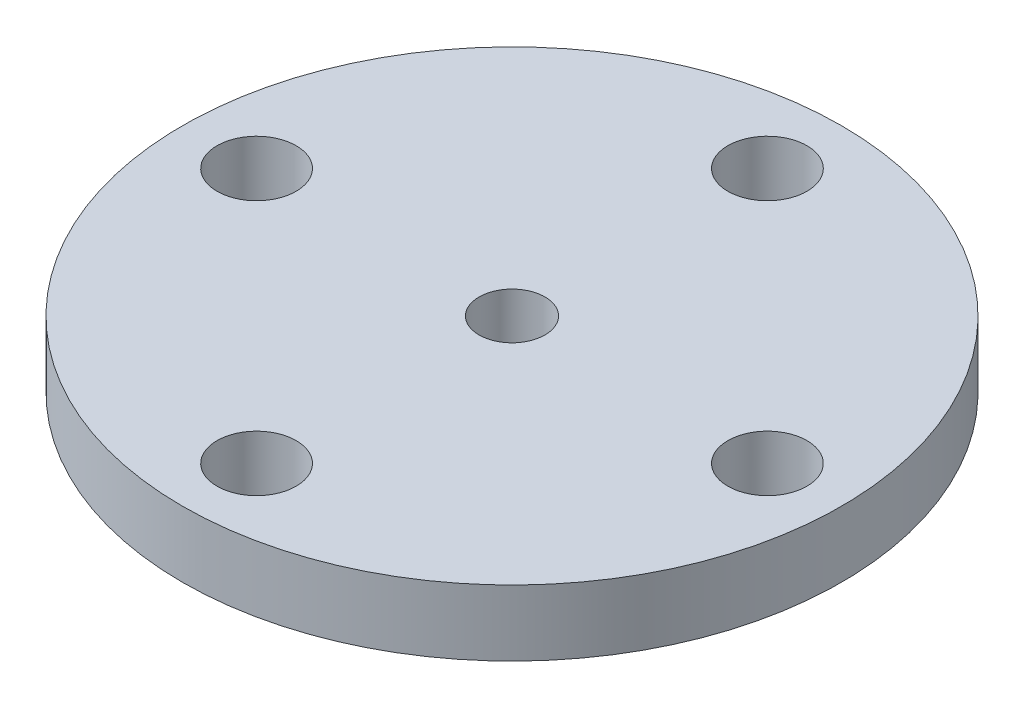
ISO-10303-21;
HEADER;
FILE_DESCRIPTION(('STEP AP214'),'2;1');
FILE_NAME('part.step','',(''),(''),'','','');
FILE_SCHEMA(('AUTOMOTIVE_DESIGN { 1 0 10303 214 1 1 1 1 }'));
ENDSEC;
DATA;
#1=APPLICATION_CONTEXT('core data for automotive mechanical design processes');
#2=APPLICATION_PROTOCOL_DEFINITION('international standard','automotive_design',2000,#1);
#3=PRODUCT_CONTEXT('',#1,'mechanical');
#4=PRODUCT('Part','Part','',(#3));
#5=PRODUCT_RELATED_PRODUCT_CATEGORY('part','',(#4));
#6=PRODUCT_DEFINITION_FORMATION('','',#4);
#7=PRODUCT_DEFINITION_CONTEXT('part definition',#1,'design');
#8=PRODUCT_DEFINITION('design','',#6,#7);
#9=PRODUCT_DEFINITION_SHAPE('','',#8);
#10=(LENGTH_UNIT() NAMED_UNIT(*) SI_UNIT(.MILLI.,.METRE.));
#11=(NAMED_UNIT(*) PLANE_ANGLE_UNIT() SI_UNIT($,.RADIAN.));
#12=(NAMED_UNIT(*) SI_UNIT($,.STERADIAN.) SOLID_ANGLE_UNIT());
#13=UNCERTAINTY_MEASURE_WITH_UNIT(LENGTH_MEASURE(1.E-05),#10,'distance_accuracy_value','');
#14=(GEOMETRIC_REPRESENTATION_CONTEXT(3) GLOBAL_UNCERTAINTY_ASSIGNED_CONTEXT((#13)) GLOBAL_UNIT_ASSIGNED_CONTEXT((#10,
#11,#12)) REPRESENTATION_CONTEXT('',''));
#15=CARTESIAN_POINT('',(0.,0.,0.));
#16=DIRECTION('',(0.,0.,1.));
#17=DIRECTION('',(1.,0.,0.));
#18=AXIS2_PLACEMENT_3D('',#15,#16,#17);
#19=CARTESIAN_POINT('',(0.,1.,0.));
#20=DIRECTION('',(0.,-1.,0.));
#21=DIRECTION('',(0.,0.,-1.));
#22=AXIS2_PLACEMENT_3D('',#19,#20,#21);
#23=CYLINDRICAL_SURFACE('',#22,5.);
#24=CARTESIAN_POINT('',(0.,1.,0.));
#25=DIRECTION('',(0.,1.,0.));
#26=DIRECTION('',(0.,0.,1.));
#27=AXIS2_PLACEMENT_3D('',#24,#25,#26);
#28=CIRCLE('',#27,5.);
#29=CARTESIAN_POINT('',(0.,1.,5.));
#30=VERTEX_POINT('',#29);
#31=EDGE_CURVE('E10',#30,#30,#28,.T.);
#32=ORIENTED_EDGE('',*,*,#31,.F.);
#33=EDGE_LOOP('',(#32));
#34=FACE_BOUND('',#33,.T.);
#35=CARTESIAN_POINT('',(0.,0.,0.));
#36=DIRECTION('',(0.,1.,0.));
#37=DIRECTION('',(0.,0.,1.));
#38=AXIS2_PLACEMENT_3D('',#35,#36,#37);
#39=CIRCLE('',#38,5.);
#40=CARTESIAN_POINT('',(0.,0.,5.));
#41=VERTEX_POINT('',#40);
#42=EDGE_CURVE('E36',#41,#41,#39,.T.);
#43=ORIENTED_EDGE('',*,*,#42,.T.);
#44=EDGE_LOOP('',(#43));
#45=FACE_BOUND('',#44,.T.);
#46=ADVANCED_FACE('F33',(#34,#45),#23,.T.);
#47=CARTESIAN_POINT('',(0.,1.,0.));
#48=DIRECTION('',(0.,1.,0.));
#49=DIRECTION('',(0.,0.,1.));
#50=AXIS2_PLACEMENT_3D('',#47,#48,#49);
#51=PLANE('',#50);
#52=CARTESIAN_POINT('',(0.,1.,3.875));
#53=DIRECTION('',(0.,1.,0.));
#54=DIRECTION('',(0.,0.,1.));
#55=AXIS2_PLACEMENT_3D('',#52,#53,#54);
#56=CIRCLE('',#55,0.6);
#57=CARTESIAN_POINT('',(0.,1.,4.475));
#58=VERTEX_POINT('',#57);
#59=EDGE_CURVE('E56',#58,#58,#56,.F.);
#60=ORIENTED_EDGE('',*,*,#59,.T.);
#61=EDGE_LOOP('',(#60));
#62=FACE_BOUND('',#61,.T.);
#63=CARTESIAN_POINT('',(3.875,1.,0.));
#64=DIRECTION('',(0.,1.,0.));
#65=DIRECTION('',(0.,0.,1.));
#66=AXIS2_PLACEMENT_3D('',#63,#64,#65);
#67=CIRCLE('',#66,0.6);
#68=CARTESIAN_POINT('',(3.875,1.,0.6));
#69=VERTEX_POINT('',#68);
#70=EDGE_CURVE('E59',#69,#69,#67,.F.);
#71=ORIENTED_EDGE('',*,*,#70,.T.);
#72=EDGE_LOOP('',(#71));
#73=FACE_BOUND('',#72,.T.);
#74=CARTESIAN_POINT('',(0.,1.,-3.875));
#75=DIRECTION('',(0.,1.,0.));
#76=DIRECTION('',(0.,0.,1.));
#77=AXIS2_PLACEMENT_3D('',#74,#75,#76);
#78=CIRCLE('',#77,0.6);
#79=CARTESIAN_POINT('',(0.,1.,-3.275));
#80=VERTEX_POINT('',#79);
#81=EDGE_CURVE('E62',#80,#80,#78,.F.);
#82=ORIENTED_EDGE('',*,*,#81,.T.);
#83=EDGE_LOOP('',(#82));
#84=FACE_BOUND('',#83,.T.);
#85=CARTESIAN_POINT('',(-3.875,1.,0.));
#86=DIRECTION('',(0.,1.,0.));
#87=DIRECTION('',(0.,0.,1.));
#88=AXIS2_PLACEMENT_3D('',#85,#86,#87);
#89=CIRCLE('',#88,0.6);
#90=CARTESIAN_POINT('',(-3.875,1.,0.6));
#91=VERTEX_POINT('',#90);
#92=EDGE_CURVE('E48',#91,#91,#89,.F.);
#93=ORIENTED_EDGE('',*,*,#92,.T.);
#94=EDGE_LOOP('',(#93));
#95=FACE_BOUND('',#94,.T.);
#96=CARTESIAN_POINT('',(0.,1.,0.));
#97=DIRECTION('',(0.,1.,0.));
#98=DIRECTION('',(0.,0.,1.));
#99=AXIS2_PLACEMENT_3D('',#96,#97,#98);
#100=CIRCLE('',#99,0.5);
#101=CARTESIAN_POINT('',(0.,1.,0.5));
#102=VERTEX_POINT('',#101);
#103=EDGE_CURVE('E43',#102,#102,#100,.T.);
#104=ORIENTED_EDGE('',*,*,#103,.F.);
#105=EDGE_LOOP('',(#104));
#106=FACE_BOUND('',#105,.T.);
#107=ORIENTED_EDGE('',*,*,#31,.T.);
#108=EDGE_LOOP('',(#107));
#109=FACE_BOUND('',#108,.T.);
#110=ADVANCED_FACE('F91',(#62,#73,#84,#95,#106,#109),#51,.T.);
#111=CARTESIAN_POINT('',(0.,0.,0.));
#112=DIRECTION('',(0.,1.,0.));
#113=DIRECTION('',(0.,0.,1.));
#114=AXIS2_PLACEMENT_3D('',#111,#112,#113);
#115=PLANE('',#114);
#116=CARTESIAN_POINT('',(0.,0.,3.875));
#117=DIRECTION('',(0.,1.,0.));
#118=DIRECTION('',(1.,0.,0.));
#119=AXIS2_PLACEMENT_3D('',#116,#117,#118);
#120=CIRCLE('',#119,0.6);
#121=CARTESIAN_POINT('',(0.600000000000013,0.,3.875));
#122=VERTEX_POINT('',#121);
#123=EDGE_CURVE('E65',#122,#122,#120,.T.);
#124=ORIENTED_EDGE('',*,*,#123,.T.);
#125=EDGE_LOOP('',(#124));
#126=FACE_BOUND('',#125,.T.);
#127=CARTESIAN_POINT('',(3.875,0.,0.));
#128=DIRECTION('',(0.,1.,0.));
#129=DIRECTION('',(0.,0.,-1.));
#130=AXIS2_PLACEMENT_3D('',#127,#128,#129);
#131=CIRCLE('',#130,0.6);
#132=CARTESIAN_POINT('',(3.875,0.,-0.6));
#133=VERTEX_POINT('',#132);
#134=EDGE_CURVE('E69',#133,#133,#131,.T.);
#135=ORIENTED_EDGE('',*,*,#134,.T.);
#136=EDGE_LOOP('',(#135));
#137=FACE_BOUND('',#136,.T.);
#138=CARTESIAN_POINT('',(0.,0.,-3.875));
#139=DIRECTION('',(0.,1.,0.));
#140=DIRECTION('',(-1.,0.,0.));
#141=AXIS2_PLACEMENT_3D('',#138,#139,#140);
#142=CIRCLE('',#141,0.6);
#143=CARTESIAN_POINT('',(-0.60000000000004,0.,-3.87499999999999));
#144=VERTEX_POINT('',#143);
#145=EDGE_CURVE('E66',#144,#144,#142,.T.);
#146=ORIENTED_EDGE('',*,*,#145,.T.);
#147=EDGE_LOOP('',(#146));
#148=FACE_BOUND('',#147,.T.);
#149=CARTESIAN_POINT('',(-3.875,0.,0.));
#150=DIRECTION('',(0.,1.,0.));
#151=DIRECTION('',(0.,0.,1.));
#152=AXIS2_PLACEMENT_3D('',#149,#150,#151);
#153=CIRCLE('',#152,0.6);
#154=CARTESIAN_POINT('',(-3.875,0.,0.6));
#155=VERTEX_POINT('',#154);
#156=EDGE_CURVE('E53',#155,#155,#153,.T.);
#157=ORIENTED_EDGE('',*,*,#156,.T.);
#158=EDGE_LOOP('',(#157));
#159=FACE_BOUND('',#158,.T.);
#160=CARTESIAN_POINT('',(0.,0.,0.));
#161=DIRECTION('',(0.,1.,0.));
#162=DIRECTION('',(0.,0.,1.));
#163=AXIS2_PLACEMENT_3D('',#160,#161,#162);
#164=CIRCLE('',#163,0.5);
#165=CARTESIAN_POINT('',(0.,0.,0.5));
#166=VERTEX_POINT('',#165);
#167=EDGE_CURVE('E45',#166,#166,#164,.T.);
#168=ORIENTED_EDGE('',*,*,#167,.T.);
#169=EDGE_LOOP('',(#168));
#170=FACE_BOUND('',#169,.T.);
#171=ORIENTED_EDGE('',*,*,#42,.F.);
#172=EDGE_LOOP('',(#171));
#173=FACE_BOUND('',#172,.T.);
#174=ADVANCED_FACE('F75',(#126,#137,#148,#159,#170,#173),#115,.F.);
#175=CARTESIAN_POINT('',(0.,1.,0.));
#176=DIRECTION('',(0.,-1.,0.));
#177=DIRECTION('',(0.,0.,-1.));
#178=AXIS2_PLACEMENT_3D('',#175,#176,#177);
#179=CYLINDRICAL_SURFACE('',#178,0.5);
#180=ORIENTED_EDGE('',*,*,#103,.T.);
#181=EDGE_LOOP('',(#180));
#182=FACE_BOUND('',#181,.T.);
#183=ORIENTED_EDGE('',*,*,#167,.F.);
#184=EDGE_LOOP('',(#183));
#185=FACE_BOUND('',#184,.T.);
#186=ADVANCED_FACE('F102',(#182,#185),#179,.F.);
#187=CARTESIAN_POINT('',(-3.875,2.,0.));
#188=DIRECTION('',(0.,-1.,0.));
#189=DIRECTION('',(0.,0.,-1.));
#190=AXIS2_PLACEMENT_3D('',#187,#188,#189);
#191=CYLINDRICAL_SURFACE('',#190,0.6);
#192=ORIENTED_EDGE('',*,*,#92,.F.);
#193=EDGE_LOOP('',(#192));
#194=FACE_BOUND('',#193,.T.);
#195=ORIENTED_EDGE('',*,*,#156,.F.);
#196=EDGE_LOOP('',(#195));
#197=FACE_BOUND('',#196,.T.);
#198=ADVANCED_FACE('F106',(#194,#197),#191,.F.);
#199=CARTESIAN_POINT('',(0.,2.,-3.875));
#200=DIRECTION('',(0.,-1.,0.));
#201=DIRECTION('',(0.,0.,-1.));
#202=AXIS2_PLACEMENT_3D('',#199,#200,#201);
#203=CYLINDRICAL_SURFACE('',#202,0.6);
#204=ORIENTED_EDGE('',*,*,#81,.F.);
#205=EDGE_LOOP('',(#204));
#206=FACE_BOUND('',#205,.T.);
#207=ORIENTED_EDGE('',*,*,#145,.F.);
#208=EDGE_LOOP('',(#207));
#209=FACE_BOUND('',#208,.T.);
#210=ADVANCED_FACE('F86',(#206,#209),#203,.F.);
#211=CARTESIAN_POINT('',(3.875,2.,0.));
#212=DIRECTION('',(0.,-1.,0.));
#213=DIRECTION('',(0.,0.,-1.));
#214=AXIS2_PLACEMENT_3D('',#211,#212,#213);
#215=CYLINDRICAL_SURFACE('',#214,0.6);
#216=ORIENTED_EDGE('',*,*,#70,.F.);
#217=EDGE_LOOP('',(#216));
#218=FACE_BOUND('',#217,.T.);
#219=ORIENTED_EDGE('',*,*,#134,.F.);
#220=EDGE_LOOP('',(#219));
#221=FACE_BOUND('',#220,.T.);
#222=ADVANCED_FACE('F80',(#218,#221),#215,.F.);
#223=CARTESIAN_POINT('',(0.,2.,3.875));
#224=DIRECTION('',(0.,-1.,0.));
#225=DIRECTION('',(0.,0.,-1.));
#226=AXIS2_PLACEMENT_3D('',#223,#224,#225);
#227=CYLINDRICAL_SURFACE('',#226,0.6);
#228=ORIENTED_EDGE('',*,*,#59,.F.);
#229=EDGE_LOOP('',(#228));
#230=FACE_BOUND('',#229,.T.);
#231=ORIENTED_EDGE('',*,*,#123,.F.);
#232=EDGE_LOOP('',(#231));
#233=FACE_BOUND('',#232,.T.);
#234=ADVANCED_FACE('F78',(#230,#233),#227,.F.);
#235=CLOSED_SHELL('',(#46,#110,#174,#186,#198,#210,#222,#234));
#236=MANIFOLD_SOLID_BREP('B2',#235);
#237=ADVANCED_BREP_SHAPE_REPRESENTATION('',(#18,#236),#14);
#238=SHAPE_DEFINITION_REPRESENTATION(#9,#237);
ENDSEC;
END-ISO-10303-21;
